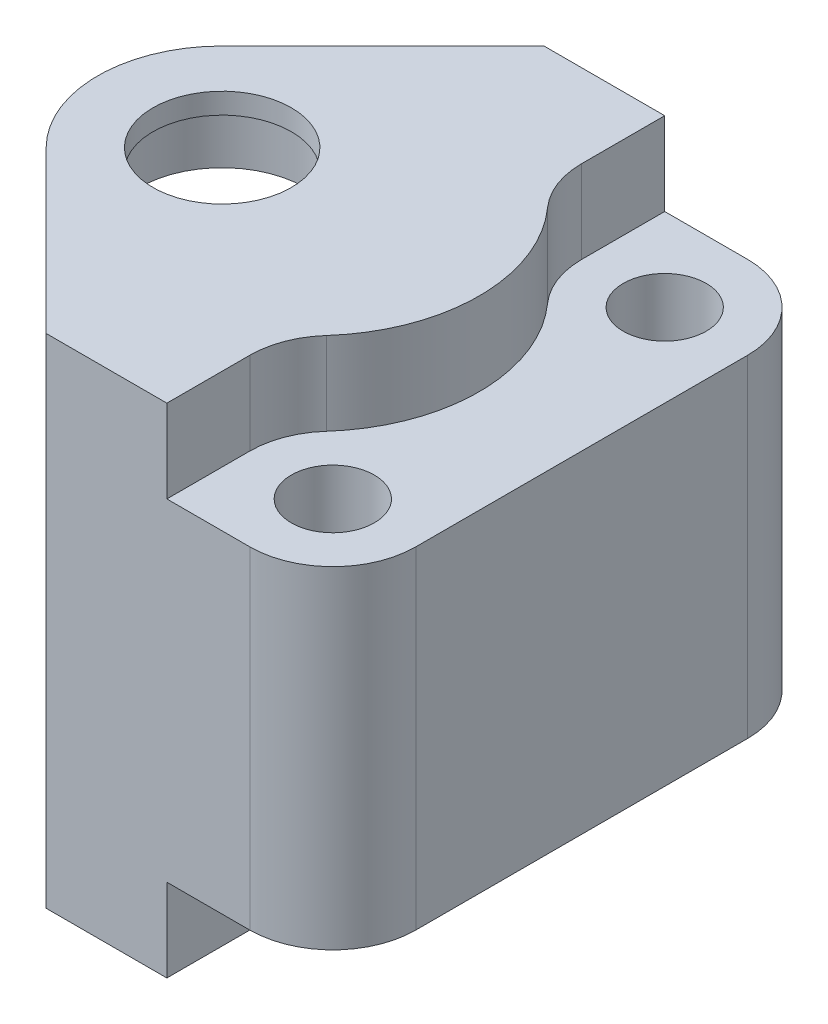
ISO-10303-21;
HEADER;
FILE_DESCRIPTION(('STEP AP214'),'2;1');
FILE_NAME('part.step','',(''),(''),'','','');
FILE_SCHEMA(('AUTOMOTIVE_DESIGN { 1 0 10303 214 1 1 1 1 }'));
ENDSEC;
DATA;
#1=APPLICATION_CONTEXT('core data for automotive mechanical design processes');
#2=APPLICATION_PROTOCOL_DEFINITION('international standard','automotive_design',2000,#1);
#3=PRODUCT_CONTEXT('',#1,'mechanical');
#4=PRODUCT('Part','Part','',(#3));
#5=PRODUCT_RELATED_PRODUCT_CATEGORY('part','',(#4));
#6=PRODUCT_DEFINITION_FORMATION('','',#4);
#7=PRODUCT_DEFINITION_CONTEXT('part definition',#1,'design');
#8=PRODUCT_DEFINITION('design','',#6,#7);
#9=PRODUCT_DEFINITION_SHAPE('','',#8);
#10=(LENGTH_UNIT() NAMED_UNIT(*) SI_UNIT(.MILLI.,.METRE.));
#11=(NAMED_UNIT(*) PLANE_ANGLE_UNIT() SI_UNIT($,.RADIAN.));
#12=(NAMED_UNIT(*) SI_UNIT($,.STERADIAN.) SOLID_ANGLE_UNIT());
#13=UNCERTAINTY_MEASURE_WITH_UNIT(LENGTH_MEASURE(1.E-05),#10,'distance_accuracy_value','');
#14=(GEOMETRIC_REPRESENTATION_CONTEXT(3) GLOBAL_UNCERTAINTY_ASSIGNED_CONTEXT((#13)) GLOBAL_UNIT_ASSIGNED_CONTEXT((#10,
#11,#12)) REPRESENTATION_CONTEXT('',''));
#15=CARTESIAN_POINT('',(0.,0.,0.));
#16=DIRECTION('',(0.,0.,1.));
#17=DIRECTION('',(1.,0.,0.));
#18=AXIS2_PLACEMENT_3D('',#15,#16,#17);
#19=CARTESIAN_POINT('',(13.,9.,-6.));
#20=DIRECTION('',(-1.,0.,0.));
#21=DIRECTION('',(0.,0.,1.));
#22=AXIS2_PLACEMENT_3D('',#19,#20,#21);
#23=PLANE('',#22);
#24=DIRECTION('',(0.,0.,1.));
#25=VECTOR('',#24,1.);
#26=CARTESIAN_POINT('',(13.,-6.,0.));
#27=LINE('',#26,#25);
#28=CARTESIAN_POINT('',(13.,-6.,-6.));
#29=VERTEX_POINT('',#28);
#30=CARTESIAN_POINT('',(13.,-6.,6.));
#31=VERTEX_POINT('',#30);
#32=EDGE_CURVE('E260',#29,#31,#27,.T.);
#33=ORIENTED_EDGE('',*,*,#32,.F.);
#34=DIRECTION('',(0.,-1.,0.));
#35=VECTOR('',#34,1.);
#36=CARTESIAN_POINT('',(13.,9.,-6.));
#37=LINE('',#36,#35);
#38=CARTESIAN_POINT('',(13.,6.,-6.));
#39=VERTEX_POINT('',#38);
#40=EDGE_CURVE('E522',#39,#29,#37,.T.);
#41=ORIENTED_EDGE('',*,*,#40,.F.);
#42=DIRECTION('',(0.,0.,-1.));
#43=VECTOR('',#42,1.);
#44=CARTESIAN_POINT('',(13.,6.,0.));
#45=LINE('',#44,#43);
#46=CARTESIAN_POINT('',(13.,6.,6.));
#47=VERTEX_POINT('',#46);
#48=EDGE_CURVE('E328',#47,#39,#45,.T.);
#49=ORIENTED_EDGE('',*,*,#48,.F.);
#50=DIRECTION('',(0.,-1.,0.));
#51=VECTOR('',#50,1.);
#52=CARTESIAN_POINT('',(13.,9.,6.));
#53=LINE('',#52,#51);
#54=EDGE_CURVE('E523',#47,#31,#53,.T.);
#55=ORIENTED_EDGE('',*,*,#54,.T.);
#56=EDGE_LOOP('',(#33,#41,#49,#55));
#57=FACE_BOUND('',#56,.T.);
#58=ADVANCED_FACE('F44',(#57),#23,.F.);
#59=CARTESIAN_POINT('',(2.63603896932105,9.,9.));
#60=DIRECTION('',(0.,0.,-1.));
#61=DIRECTION('',(-1.,0.,0.));
#62=AXIS2_PLACEMENT_3D('',#59,#60,#61);
#63=PLANE('',#62);
#64=DIRECTION('',(-1.,0.,0.));
#65=VECTOR('',#64,1.);
#66=CARTESIAN_POINT('',(0.,-6.,9.));
#67=LINE('',#66,#65);
#68=CARTESIAN_POINT('',(10.,-6.,9.));
#69=VERTEX_POINT('',#68);
#70=CARTESIAN_POINT('',(7.,-6.,9.));
#71=VERTEX_POINT('',#70);
#72=EDGE_CURVE('E246',#69,#71,#67,.T.);
#73=ORIENTED_EDGE('',*,*,#72,.F.);
#74=DIRECTION('',(0.,-1.,0.));
#75=VECTOR('',#74,1.);
#76=CARTESIAN_POINT('',(10.,9.,9.));
#77=LINE('',#76,#75);
#78=CARTESIAN_POINT('',(10.,6.,9.));
#79=VERTEX_POINT('',#78);
#80=EDGE_CURVE('E530',#79,#69,#77,.T.);
#81=ORIENTED_EDGE('',*,*,#80,.F.);
#82=DIRECTION('',(1.,0.,0.));
#83=VECTOR('',#82,1.);
#84=CARTESIAN_POINT('',(0.,6.,9.));
#85=LINE('',#84,#83);
#86=CARTESIAN_POINT('',(7.,6.,9.));
#87=VERTEX_POINT('',#86);
#88=EDGE_CURVE('E337',#87,#79,#85,.T.);
#89=ORIENTED_EDGE('',*,*,#88,.F.);
#90=DIRECTION('',(0.,1.,0.));
#91=VECTOR('',#90,1.);
#92=CARTESIAN_POINT('',(7.,6.,9.));
#93=LINE('',#92,#91);
#94=CARTESIAN_POINT('',(7.,9.,9.));
#95=VERTEX_POINT('',#94);
#96=EDGE_CURVE('E363',#87,#95,#93,.T.);
#97=ORIENTED_EDGE('',*,*,#96,.T.);
#98=DIRECTION('',(1.,0.,0.));
#99=VECTOR('',#98,1.);
#100=CARTESIAN_POINT('',(2.63603896932105,9.,9.));
#101=LINE('',#100,#99);
#102=CARTESIAN_POINT('',(2.63603896932105,9.,9.));
#103=VERTEX_POINT('',#102);
#104=EDGE_CURVE('E477',#103,#95,#101,.T.);
#105=ORIENTED_EDGE('',*,*,#104,.F.);
#106=DIRECTION('',(0.,-1.,0.));
#107=VECTOR('',#106,1.);
#108=CARTESIAN_POINT('',(2.63603896932105,9.,9.));
#109=LINE('',#108,#107);
#110=CARTESIAN_POINT('',(2.63603896932105,6.25,9.));
#111=VERTEX_POINT('',#110);
#112=EDGE_CURVE('E534',#103,#111,#109,.T.);
#113=ORIENTED_EDGE('',*,*,#112,.T.);
#114=DIRECTION('',(0.,-1.,0.));
#115=VECTOR('',#114,1.);
#116=CARTESIAN_POINT('',(2.63603896932105,6.25,9.));
#117=LINE('',#116,#115);
#118=CARTESIAN_POINT('',(2.63603896932105,-6.25,9.));
#119=VERTEX_POINT('',#118);
#120=EDGE_CURVE('E459',#111,#119,#117,.T.);
#121=ORIENTED_EDGE('',*,*,#120,.T.);
#122=CARTESIAN_POINT('',(2.63603896932105,-9.,9.));
#123=VERTEX_POINT('',#122);
#124=EDGE_CURVE('E531',#119,#123,#109,.T.);
#125=ORIENTED_EDGE('',*,*,#124,.T.);
#126=DIRECTION('',(1.,0.,0.));
#127=VECTOR('',#126,1.);
#128=CARTESIAN_POINT('',(2.63603896932105,-9.,9.));
#129=LINE('',#128,#127);
#130=CARTESIAN_POINT('',(7.,-9.,9.));
#131=VERTEX_POINT('',#130);
#132=EDGE_CURVE('E499',#123,#131,#129,.T.);
#133=ORIENTED_EDGE('',*,*,#132,.T.);
#134=DIRECTION('',(0.,-1.,0.));
#135=VECTOR('',#134,1.);
#136=CARTESIAN_POINT('',(7.,-6.,9.));
#137=LINE('',#136,#135);
#138=EDGE_CURVE('E297',#71,#131,#137,.T.);
#139=ORIENTED_EDGE('',*,*,#138,.F.);
#140=EDGE_LOOP('',(#73,#81,#89,#97,#105,#113,#121,#125,#133,#139));
#141=FACE_BOUND('',#140,.T.);
#142=ADVANCED_FACE('F567',(#141),#63,.F.);
#143=CARTESIAN_POINT('',(10.,9.,6.));
#144=DIRECTION('',(0.,-1.,0.));
#145=DIRECTION('',(0.,0.,-1.));
#146=AXIS2_PLACEMENT_3D('',#143,#144,#145);
#147=CYLINDRICAL_SURFACE('',#146,3.);
#148=CARTESIAN_POINT('',(10.,-6.,6.));
#149=DIRECTION('',(0.,-1.,0.));
#150=DIRECTION('',(0.,0.,-1.));
#151=AXIS2_PLACEMENT_3D('',#148,#149,#150);
#152=CIRCLE('',#151,3.);
#153=EDGE_CURVE('E255',#31,#69,#152,.T.);
#154=ORIENTED_EDGE('',*,*,#153,.F.);
#155=ORIENTED_EDGE('',*,*,#54,.F.);
#156=CARTESIAN_POINT('',(10.,6.,6.));
#157=DIRECTION('',(0.,-1.,0.));
#158=DIRECTION('',(0.,0.,-1.));
#159=AXIS2_PLACEMENT_3D('',#156,#157,#158);
#160=CIRCLE('',#159,3.);
#161=EDGE_CURVE('E335',#47,#79,#160,.T.);
#162=ORIENTED_EDGE('',*,*,#161,.T.);
#163=ORIENTED_EDGE('',*,*,#80,.T.);
#164=EDGE_LOOP('',(#154,#155,#162,#163));
#165=FACE_BOUND('',#164,.T.);
#166=ADVANCED_FACE('F573',(#165),#147,.T.);
#167=CARTESIAN_POINT('',(10.,9.,-6.));
#168=DIRECTION('',(0.,-1.,0.));
#169=DIRECTION('',(0.,0.,-1.));
#170=AXIS2_PLACEMENT_3D('',#167,#168,#169);
#171=CYLINDRICAL_SURFACE('',#170,3.);
#172=CARTESIAN_POINT('',(10.,-6.,-6.));
#173=DIRECTION('',(0.,-1.,0.));
#174=DIRECTION('',(0.,0.,-1.));
#175=AXIS2_PLACEMENT_3D('',#172,#173,#174);
#176=CIRCLE('',#175,3.);
#177=CARTESIAN_POINT('',(10.,-6.,-9.));
#178=VERTEX_POINT('',#177);
#179=EDGE_CURVE('E257',#178,#29,#176,.T.);
#180=ORIENTED_EDGE('',*,*,#179,.F.);
#181=DIRECTION('',(0.,-1.,0.));
#182=VECTOR('',#181,1.);
#183=CARTESIAN_POINT('',(10.,9.,-9.));
#184=LINE('',#183,#182);
#185=CARTESIAN_POINT('',(10.,6.,-9.));
#186=VERTEX_POINT('',#185);
#187=EDGE_CURVE('E520',#186,#178,#184,.T.);
#188=ORIENTED_EDGE('',*,*,#187,.F.);
#189=CARTESIAN_POINT('',(10.,6.,-6.));
#190=DIRECTION('',(0.,-1.,0.));
#191=DIRECTION('',(0.,0.,-1.));
#192=AXIS2_PLACEMENT_3D('',#189,#190,#191);
#193=CIRCLE('',#192,3.);
#194=EDGE_CURVE('E324',#186,#39,#193,.T.);
#195=ORIENTED_EDGE('',*,*,#194,.T.);
#196=ORIENTED_EDGE('',*,*,#40,.T.);
#197=EDGE_LOOP('',(#180,#188,#195,#196));
#198=FACE_BOUND('',#197,.T.);
#199=ADVANCED_FACE('F576',(#198),#171,.T.);
#200=CARTESIAN_POINT('',(10.,9.,-6.));
#201=DIRECTION('',(0.,-1.,0.));
#202=DIRECTION('',(0.,0.,-1.));
#203=AXIS2_PLACEMENT_3D('',#200,#201,#202);
#204=CYLINDRICAL_SURFACE('',#203,1.5);
#205=CARTESIAN_POINT('',(10.,6.,-6.));
#206=DIRECTION('',(0.,-1.,0.));
#207=DIRECTION('',(0.,0.,-1.));
#208=AXIS2_PLACEMENT_3D('',#205,#206,#207);
#209=CIRCLE('',#208,1.5);
#210=CARTESIAN_POINT('',(10.,6.,-7.5));
#211=VERTEX_POINT('',#210);
#212=EDGE_CURVE('E378',#211,#211,#209,.T.);
#213=ORIENTED_EDGE('',*,*,#212,.F.);
#214=EDGE_LOOP('',(#213));
#215=FACE_BOUND('',#214,.T.);
#216=CARTESIAN_POINT('',(10.,-6.,-6.));
#217=DIRECTION('',(0.,-1.,0.));
#218=DIRECTION('',(0.,0.,-1.));
#219=AXIS2_PLACEMENT_3D('',#216,#217,#218);
#220=CIRCLE('',#219,1.5);
#221=CARTESIAN_POINT('',(10.,-6.,-7.5));
#222=VERTEX_POINT('',#221);
#223=EDGE_CURVE('E302',#222,#222,#220,.T.);
#224=ORIENTED_EDGE('',*,*,#223,.T.);
#225=EDGE_LOOP('',(#224));
#226=FACE_BOUND('',#225,.T.);
#227=ADVANCED_FACE('F547',(#215,#226),#204,.F.);
#228=CARTESIAN_POINT('',(10.,9.,6.));
#229=DIRECTION('',(0.,-1.,0.));
#230=DIRECTION('',(0.,0.,-1.));
#231=AXIS2_PLACEMENT_3D('',#228,#229,#230);
#232=CYLINDRICAL_SURFACE('',#231,1.5);
#233=CARTESIAN_POINT('',(10.,6.,6.));
#234=DIRECTION('',(0.,-1.,0.));
#235=DIRECTION('',(0.,0.,-1.));
#236=AXIS2_PLACEMENT_3D('',#233,#234,#235);
#237=CIRCLE('',#236,1.5);
#238=CARTESIAN_POINT('',(10.,6.,4.5));
#239=VERTEX_POINT('',#238);
#240=EDGE_CURVE('E380',#239,#239,#237,.T.);
#241=ORIENTED_EDGE('',*,*,#240,.F.);
#242=EDGE_LOOP('',(#241));
#243=FACE_BOUND('',#242,.T.);
#244=CARTESIAN_POINT('',(10.,-6.,6.));
#245=DIRECTION('',(0.,-1.,0.));
#246=DIRECTION('',(0.,0.,-1.));
#247=AXIS2_PLACEMENT_3D('',#244,#245,#246);
#248=CIRCLE('',#247,1.5);
#249=CARTESIAN_POINT('',(10.,-6.,4.5));
#250=VERTEX_POINT('',#249);
#251=EDGE_CURVE('E47',#250,#250,#248,.T.);
#252=ORIENTED_EDGE('',*,*,#251,.T.);
#253=EDGE_LOOP('',(#252));
#254=FACE_BOUND('',#253,.T.);
#255=ADVANCED_FACE('F542',(#243,#254),#232,.F.);
#256=CARTESIAN_POINT('',(2.63603896932105,9.,-9.));
#257=DIRECTION('',(0.,0.,1.));
#258=DIRECTION('',(1.,0.,0.));
#259=AXIS2_PLACEMENT_3D('',#256,#257,#258);
#260=PLANE('',#259);
#261=DIRECTION('',(1.,0.,0.));
#262=VECTOR('',#261,1.);
#263=CARTESIAN_POINT('',(0.,-6.,-9.00000000000001));
#264=LINE('',#263,#262);
#265=CARTESIAN_POINT('',(7.,-6.,-9.));
#266=VERTEX_POINT('',#265);
#267=EDGE_CURVE('E263',#266,#178,#264,.T.);
#268=ORIENTED_EDGE('',*,*,#267,.F.);
#269=DIRECTION('',(0.,-1.,0.));
#270=VECTOR('',#269,1.);
#271=CARTESIAN_POINT('',(7.,-6.,-9.));
#272=LINE('',#271,#270);
#273=CARTESIAN_POINT('',(7.,-9.,-9.));
#274=VERTEX_POINT('',#273);
#275=EDGE_CURVE('E295',#266,#274,#272,.T.);
#276=ORIENTED_EDGE('',*,*,#275,.T.);
#277=DIRECTION('',(-1.,0.,0.));
#278=VECTOR('',#277,1.);
#279=CARTESIAN_POINT('',(2.63603896932105,-9.,-9.));
#280=LINE('',#279,#278);
#281=CARTESIAN_POINT('',(2.63603896932105,-9.,-9.));
#282=VERTEX_POINT('',#281);
#283=EDGE_CURVE('E505',#274,#282,#280,.T.);
#284=ORIENTED_EDGE('',*,*,#283,.T.);
#285=DIRECTION('',(0.,-1.,0.));
#286=VECTOR('',#285,1.);
#287=CARTESIAN_POINT('',(2.63603896932105,9.,-9.));
#288=LINE('',#287,#286);
#289=CARTESIAN_POINT('',(2.63603896932105,-6.25,-9.));
#290=VERTEX_POINT('',#289);
#291=EDGE_CURVE('E515',#290,#282,#288,.T.);
#292=ORIENTED_EDGE('',*,*,#291,.F.);
#293=DIRECTION('',(0.,-1.,0.));
#294=VECTOR('',#293,1.);
#295=CARTESIAN_POINT('',(2.63603896932105,6.25,-9.));
#296=LINE('',#295,#294);
#297=CARTESIAN_POINT('',(2.63603896932105,6.25,-9.));
#298=VERTEX_POINT('',#297);
#299=EDGE_CURVE('E463',#298,#290,#296,.T.);
#300=ORIENTED_EDGE('',*,*,#299,.F.);
#301=CARTESIAN_POINT('',(2.63603896932105,9.,-9.));
#302=VERTEX_POINT('',#301);
#303=EDGE_CURVE('E511',#302,#298,#288,.T.);
#304=ORIENTED_EDGE('',*,*,#303,.F.);
#305=DIRECTION('',(-1.,0.,0.));
#306=VECTOR('',#305,1.);
#307=CARTESIAN_POINT('',(2.63603896932105,9.,-9.));
#308=LINE('',#307,#306);
#309=CARTESIAN_POINT('',(7.,9.,-9.));
#310=VERTEX_POINT('',#309);
#311=EDGE_CURVE('E482',#310,#302,#308,.T.);
#312=ORIENTED_EDGE('',*,*,#311,.F.);
#313=DIRECTION('',(0.,1.,0.));
#314=VECTOR('',#313,1.);
#315=CARTESIAN_POINT('',(7.,6.,-9.));
#316=LINE('',#315,#314);
#317=CARTESIAN_POINT('',(7.,6.,-9.));
#318=VERTEX_POINT('',#317);
#319=EDGE_CURVE('E364',#318,#310,#316,.T.);
#320=ORIENTED_EDGE('',*,*,#319,.F.);
#321=DIRECTION('',(-1.,0.,0.));
#322=VECTOR('',#321,1.);
#323=CARTESIAN_POINT('',(0.,6.,-9.00000000000001));
#324=LINE('',#323,#322);
#325=EDGE_CURVE('E321',#186,#318,#324,.T.);
#326=ORIENTED_EDGE('',*,*,#325,.F.);
#327=ORIENTED_EDGE('',*,*,#187,.T.);
#328=EDGE_LOOP('',(#268,#276,#284,#292,#300,#304,#312,#320,#326,#327));
#329=FACE_BOUND('',#328,.T.);
#330=ADVANCED_FACE('F550',(#329),#260,.F.);
#331=CARTESIAN_POINT('',(-3.18198051533947,9.,3.18198051533946));
#332=DIRECTION('',(0.707106781186549,0.,-0.707106781186546));
#333=DIRECTION('',(-0.707106781186546,0.,-0.707106781186549));
#334=AXIS2_PLACEMENT_3D('',#331,#332,#333);
#335=PLANE('',#334);
#336=DIRECTION('',(0.707106781186546,0.,0.707106781186549));
#337=VECTOR('',#336,1.);
#338=CARTESIAN_POINT('',(-3.18198051533947,-6.25,3.18198051533946));
#339=LINE('',#338,#337);
#340=CARTESIAN_POINT('',(-3.18198051533947,-6.25,3.18198051533946));
#341=VERTEX_POINT('',#340);
#342=EDGE_CURVE('E452',#341,#119,#339,.T.);
#343=ORIENTED_EDGE('',*,*,#342,.F.);
#344=DIRECTION('',(0.,-1.,0.));
#345=VECTOR('',#344,1.);
#346=CARTESIAN_POINT('',(-3.18198051533947,9.,3.18198051533946));
#347=LINE('',#346,#345);
#348=CARTESIAN_POINT('',(-3.18198051533947,-9.,3.18198051533946));
#349=VERTEX_POINT('',#348);
#350=EDGE_CURVE('E54',#341,#349,#347,.T.);
#351=ORIENTED_EDGE('',*,*,#350,.T.);
#352=DIRECTION('',(0.707106781186546,0.,0.707106781186549));
#353=VECTOR('',#352,1.);
#354=CARTESIAN_POINT('',(-3.18198051533947,-9.,3.18198051533946));
#355=LINE('',#354,#353);
#356=EDGE_CURVE('E493',#349,#123,#355,.T.);
#357=ORIENTED_EDGE('',*,*,#356,.T.);
#358=ORIENTED_EDGE('',*,*,#124,.F.);
#359=EDGE_LOOP('',(#343,#351,#357,#358));
#360=FACE_BOUND('',#359,.T.);
#361=ADVANCED_FACE('F590',(#360),#335,.F.);
#362=CARTESIAN_POINT('',(-3.18198051533947,9.,-3.18198051533946));
#363=DIRECTION('',(0.707106781186549,0.,0.707106781186546));
#364=DIRECTION('',(0.707106781186546,0.,-0.707106781186549));
#365=AXIS2_PLACEMENT_3D('',#362,#363,#364);
#366=PLANE('',#365);
#367=DIRECTION('',(-0.707106781186546,0.,0.707106781186549));
#368=VECTOR('',#367,1.);
#369=CARTESIAN_POINT('',(2.63603896932105,-6.25,-9.));
#370=LINE('',#369,#368);
#371=CARTESIAN_POINT('',(-3.18198051533947,-6.25,-3.18198051533946));
#372=VERTEX_POINT('',#371);
#373=EDGE_CURVE('E443',#290,#372,#370,.T.);
#374=ORIENTED_EDGE('',*,*,#373,.F.);
#375=ORIENTED_EDGE('',*,*,#291,.T.);
#376=DIRECTION('',(-0.707106781186546,0.,0.707106781186549));
#377=VECTOR('',#376,1.);
#378=CARTESIAN_POINT('',(-3.18198051533947,-9.,-3.18198051533946));
#379=LINE('',#378,#377);
#380=CARTESIAN_POINT('',(-3.18198051533947,-9.,-3.18198051533946));
#381=VERTEX_POINT('',#380);
#382=EDGE_CURVE('E480',#282,#381,#379,.T.);
#383=ORIENTED_EDGE('',*,*,#382,.T.);
#384=DIRECTION('',(0.,-1.,0.));
#385=VECTOR('',#384,1.);
#386=CARTESIAN_POINT('',(-3.18198051533947,9.,-3.18198051533946));
#387=LINE('',#386,#385);
#388=EDGE_CURVE('E489',#372,#381,#387,.T.);
#389=ORIENTED_EDGE('',*,*,#388,.F.);
#390=EDGE_LOOP('',(#374,#375,#383,#389));
#391=FACE_BOUND('',#390,.T.);
#392=ADVANCED_FACE('F594',(#391),#366,.F.);
#393=CARTESIAN_POINT('',(0.,9.,0.));
#394=DIRECTION('',(0.,-1.,0.));
#395=DIRECTION('',(0.,0.,-1.));
#396=AXIS2_PLACEMENT_3D('',#393,#394,#395);
#397=CYLINDRICAL_SURFACE('',#396,4.5);
#398=CARTESIAN_POINT('',(0.,-6.25,0.));
#399=DIRECTION('',(0.,1.,0.));
#400=DIRECTION('',(0.,0.,1.));
#401=AXIS2_PLACEMENT_3D('',#398,#399,#400);
#402=CIRCLE('',#401,4.5);
#403=EDGE_CURVE('E448',#372,#341,#402,.T.);
#404=ORIENTED_EDGE('',*,*,#403,.F.);
#405=ORIENTED_EDGE('',*,*,#388,.T.);
#406=CARTESIAN_POINT('',(0.,-9.,0.));
#407=DIRECTION('',(0.,1.,0.));
#408=DIRECTION('',(0.,0.,-1.));
#409=AXIS2_PLACEMENT_3D('',#406,#407,#408);
#410=CIRCLE('',#409,4.5);
#411=EDGE_CURVE('E473',#381,#349,#410,.T.);
#412=ORIENTED_EDGE('',*,*,#411,.T.);
#413=ORIENTED_EDGE('',*,*,#350,.F.);
#414=EDGE_LOOP('',(#404,#405,#412,#413));
#415=FACE_BOUND('',#414,.T.);
#416=ADVANCED_FACE('F598',(#415),#397,.T.);
#417=CARTESIAN_POINT('',(0.,9.,0.));
#418=DIRECTION('',(0.,-1.,0.));
#419=DIRECTION('',(0.,0.,-1.));
#420=AXIS2_PLACEMENT_3D('',#417,#418,#419);
#421=PLANE('',#420);
#422=DIRECTION('',(0.,0.,1.));
#423=VECTOR('',#422,1.);
#424=CARTESIAN_POINT('',(7.,9.,0.));
#425=LINE('',#424,#423);
#426=CARTESIAN_POINT('',(7.,9.,-6.));
#427=VERTEX_POINT('',#426);
#428=EDGE_CURVE('E72',#310,#427,#425,.T.);
#429=ORIENTED_EDGE('',*,*,#428,.F.);
#430=ORIENTED_EDGE('',*,*,#311,.T.);
#431=DIRECTION('',(-0.707106781186546,0.,0.707106781186549));
#432=VECTOR('',#431,1.);
#433=CARTESIAN_POINT('',(-3.18198051533947,9.,-3.18198051533946));
#434=LINE('',#433,#432);
#435=CARTESIAN_POINT('',(-3.18198051533947,9.,-3.18198051533946));
#436=VERTEX_POINT('',#435);
#437=EDGE_CURVE('E490',#302,#436,#434,.T.);
#438=ORIENTED_EDGE('',*,*,#437,.T.);
#439=CARTESIAN_POINT('',(0.,9.,0.));
#440=DIRECTION('',(0.,1.,0.));
#441=DIRECTION('',(0.,0.,-1.));
#442=AXIS2_PLACEMENT_3D('',#439,#440,#441);
#443=CIRCLE('',#442,4.5);
#444=CARTESIAN_POINT('',(-3.18198051533947,9.,3.18198051533946));
#445=VERTEX_POINT('',#444);
#446=EDGE_CURVE('E472',#436,#445,#443,.T.);
#447=ORIENTED_EDGE('',*,*,#446,.T.);
#448=DIRECTION('',(0.707106781186546,0.,0.707106781186549));
#449=VECTOR('',#448,1.);
#450=CARTESIAN_POINT('',(-3.18198051533947,9.,3.18198051533946));
#451=LINE('',#450,#449);
#452=EDGE_CURVE('E478',#445,#103,#451,.T.);
#453=ORIENTED_EDGE('',*,*,#452,.T.);
#454=ORIENTED_EDGE('',*,*,#104,.T.);
#455=DIRECTION('',(0.,0.,1.));
#456=VECTOR('',#455,1.);
#457=CARTESIAN_POINT('',(7.,9.,0.));
#458=LINE('',#457,#456);
#459=CARTESIAN_POINT('',(7.,9.,6.));
#460=VERTEX_POINT('',#459);
#461=EDGE_CURVE('E309',#460,#95,#458,.T.);
#462=ORIENTED_EDGE('',*,*,#461,.F.);
#463=CARTESIAN_POINT('',(10.,9.,6.));
#464=DIRECTION('',(0.,-1.,0.));
#465=DIRECTION('',(0.,0.,-1.));
#466=AXIS2_PLACEMENT_3D('',#463,#464,#465);
#467=CIRCLE('',#466,3.);
#468=CARTESIAN_POINT('',(7.76393202250021,9.,4.));
#469=VERTEX_POINT('',#468);
#470=EDGE_CURVE('E303',#460,#469,#467,.T.);
#471=ORIENTED_EDGE('',*,*,#470,.T.);
#472=CARTESIAN_POINT('',(3.29179606750063,9.,0.));
#473=DIRECTION('',(0.,-1.,0.));
#474=DIRECTION('',(0.,0.,-1.));
#475=AXIS2_PLACEMENT_3D('',#472,#473,#474);
#476=CIRCLE('',#475,6.);
#477=CARTESIAN_POINT('',(7.76393202250021,9.,-4.));
#478=VERTEX_POINT('',#477);
#479=EDGE_CURVE('E350',#478,#469,#476,.T.);
#480=ORIENTED_EDGE('',*,*,#479,.F.);
#481=CARTESIAN_POINT('',(10.,9.,-6.));
#482=DIRECTION('',(0.,-1.,0.));
#483=DIRECTION('',(0.,0.,-1.));
#484=AXIS2_PLACEMENT_3D('',#481,#482,#483);
#485=CIRCLE('',#484,3.);
#486=EDGE_CURVE('E352',#478,#427,#485,.T.);
#487=ORIENTED_EDGE('',*,*,#486,.T.);
#488=EDGE_LOOP('',(#429,#430,#438,#447,#453,#454,#462,#471,#480,#487));
#489=FACE_BOUND('',#488,.T.);
#490=CARTESIAN_POINT('',(0.,9.,0.));
#491=DIRECTION('',(0.,-1.,0.));
#492=DIRECTION('',(0.,0.,-1.));
#493=AXIS2_PLACEMENT_3D('',#490,#491,#492);
#494=CIRCLE('',#493,2.5);
#495=CARTESIAN_POINT('',(0.,9.,-2.5));
#496=VERTEX_POINT('',#495);
#497=EDGE_CURVE('E397',#496,#496,#494,.T.);
#498=ORIENTED_EDGE('',*,*,#497,.T.);
#499=EDGE_LOOP('',(#498));
#500=FACE_BOUND('',#499,.T.);
#501=ADVANCED_FACE('F669',(#489,#500),#421,.F.);
#502=CARTESIAN_POINT('',(0.,-9.,0.));
#503=DIRECTION('',(0.,-1.,0.));
#504=DIRECTION('',(0.,0.,-1.));
#505=AXIS2_PLACEMENT_3D('',#502,#503,#504);
#506=PLANE('',#505);
#507=DIRECTION('',(0.,0.,-1.));
#508=VECTOR('',#507,1.);
#509=CARTESIAN_POINT('',(7.,-9.,0.));
#510=LINE('',#509,#508);
#511=CARTESIAN_POINT('',(7.,-9.,-6.));
#512=VERTEX_POINT('',#511);
#513=EDGE_CURVE('E282',#512,#274,#510,.T.);
#514=ORIENTED_EDGE('',*,*,#513,.F.);
#515=CARTESIAN_POINT('',(10.,-9.,-6.));
#516=DIRECTION('',(0.,-1.,0.));
#517=DIRECTION('',(0.,0.,-1.));
#518=AXIS2_PLACEMENT_3D('',#515,#516,#517);
#519=CIRCLE('',#518,3.);
#520=CARTESIAN_POINT('',(7.76393202250021,-9.,-4.));
#521=VERTEX_POINT('',#520);
#522=EDGE_CURVE('E235',#521,#512,#519,.T.);
#523=ORIENTED_EDGE('',*,*,#522,.F.);
#524=CARTESIAN_POINT('',(3.29179606750063,-9.,0.));
#525=DIRECTION('',(0.,-1.,0.));
#526=DIRECTION('',(0.,0.,-1.));
#527=AXIS2_PLACEMENT_3D('',#524,#525,#526);
#528=CIRCLE('',#527,6.);
#529=CARTESIAN_POINT('',(7.76393202250021,-9.,4.));
#530=VERTEX_POINT('',#529);
#531=EDGE_CURVE('E63',#521,#530,#528,.T.);
#532=ORIENTED_EDGE('',*,*,#531,.T.);
#533=CARTESIAN_POINT('',(10.,-9.,6.));
#534=DIRECTION('',(0.,-1.,0.));
#535=DIRECTION('',(0.,0.,-1.));
#536=AXIS2_PLACEMENT_3D('',#533,#534,#535);
#537=CIRCLE('',#536,3.);
#538=CARTESIAN_POINT('',(7.,-9.,6.));
#539=VERTEX_POINT('',#538);
#540=EDGE_CURVE('E239',#539,#530,#537,.T.);
#541=ORIENTED_EDGE('',*,*,#540,.F.);
#542=DIRECTION('',(0.,0.,-1.));
#543=VECTOR('',#542,1.);
#544=CARTESIAN_POINT('',(7.,-9.,0.));
#545=LINE('',#544,#543);
#546=EDGE_CURVE('E280',#131,#539,#545,.T.);
#547=ORIENTED_EDGE('',*,*,#546,.F.);
#548=ORIENTED_EDGE('',*,*,#132,.F.);
#549=ORIENTED_EDGE('',*,*,#356,.F.);
#550=ORIENTED_EDGE('',*,*,#411,.F.);
#551=ORIENTED_EDGE('',*,*,#382,.F.);
#552=ORIENTED_EDGE('',*,*,#283,.F.);
#553=EDGE_LOOP('',(#514,#523,#532,#541,#547,#548,#549,#550,#551,#552));
#554=FACE_BOUND('',#553,.T.);
#555=CARTESIAN_POINT('',(0.,-9.,0.));
#556=DIRECTION('',(0.,-1.,0.));
#557=DIRECTION('',(0.,0.,-1.));
#558=AXIS2_PLACEMENT_3D('',#555,#556,#557);
#559=CIRCLE('',#558,2.5);
#560=CARTESIAN_POINT('',(0.,-9.,-2.5));
#561=VERTEX_POINT('',#560);
#562=EDGE_CURVE('E389',#561,#561,#559,.T.);
#563=ORIENTED_EDGE('',*,*,#562,.F.);
#564=EDGE_LOOP('',(#563));
#565=FACE_BOUND('',#564,.T.);
#566=ADVANCED_FACE('F596',(#554,#565),#506,.T.);
#567=CARTESIAN_POINT('',(-3.18198051533947,6.25,-3.18198051533946));
#568=VERTEX_POINT('',#567);
#569=EDGE_CURVE('E509',#436,#568,#387,.T.);
#570=ORIENTED_EDGE('',*,*,#569,.T.);
#571=CARTESIAN_POINT('',(0.,6.25,0.));
#572=DIRECTION('',(0.,1.,0.));
#573=DIRECTION('',(0.,0.,1.));
#574=AXIS2_PLACEMENT_3D('',#571,#572,#573);
#575=CIRCLE('',#574,4.5);
#576=CARTESIAN_POINT('',(-3.18198051533947,6.25,3.18198051533946));
#577=VERTEX_POINT('',#576);
#578=EDGE_CURVE('E430',#568,#577,#575,.T.);
#579=ORIENTED_EDGE('',*,*,#578,.T.);
#580=EDGE_CURVE('E11',#445,#577,#347,.T.);
#581=ORIENTED_EDGE('',*,*,#580,.F.);
#582=ORIENTED_EDGE('',*,*,#446,.F.);
#583=EDGE_LOOP('',(#570,#579,#581,#582));
#584=FACE_BOUND('',#583,.T.);
#585=ADVANCED_FACE('F50',(#584),#397,.T.);
#586=ORIENTED_EDGE('',*,*,#580,.T.);
#587=DIRECTION('',(0.707106781186546,0.,0.707106781186549));
#588=VECTOR('',#587,1.);
#589=CARTESIAN_POINT('',(-3.18198051533947,6.25,3.18198051533946));
#590=LINE('',#589,#588);
#591=EDGE_CURVE('E431',#577,#111,#590,.T.);
#592=ORIENTED_EDGE('',*,*,#591,.T.);
#593=ORIENTED_EDGE('',*,*,#112,.F.);
#594=ORIENTED_EDGE('',*,*,#452,.F.);
#595=EDGE_LOOP('',(#586,#592,#593,#594));
#596=FACE_BOUND('',#595,.T.);
#597=ADVANCED_FACE('F581',(#596),#335,.F.);
#598=ORIENTED_EDGE('',*,*,#303,.T.);
#599=DIRECTION('',(-0.707106781186546,0.,0.707106781186549));
#600=VECTOR('',#599,1.);
#601=CARTESIAN_POINT('',(2.63603896932105,6.25,-9.));
#602=LINE('',#601,#600);
#603=EDGE_CURVE('E421',#298,#568,#602,.T.);
#604=ORIENTED_EDGE('',*,*,#603,.T.);
#605=ORIENTED_EDGE('',*,*,#569,.F.);
#606=ORIENTED_EDGE('',*,*,#437,.F.);
#607=EDGE_LOOP('',(#598,#604,#605,#606));
#608=FACE_BOUND('',#607,.T.);
#609=ADVANCED_FACE('F584',(#608),#366,.F.);
#610=CARTESIAN_POINT('',(0.,6.25,0.));
#611=DIRECTION('',(0.,-1.,0.));
#612=DIRECTION('',(0.,0.,-1.));
#613=AXIS2_PLACEMENT_3D('',#610,#611,#612);
#614=CYLINDRICAL_SURFACE('',#613,5.25);
#615=CARTESIAN_POINT('',(0.,-6.25,0.));
#616=DIRECTION('',(0.,1.,0.));
#617=DIRECTION('',(0.,0.,-1.));
#618=AXIS2_PLACEMENT_3D('',#615,#616,#617);
#619=CIRCLE('',#618,5.25);
#620=CARTESIAN_POINT('',(5.00096940847824,-6.25,1.59774997276322));
#621=VERTEX_POINT('',#620);
#622=CARTESIAN_POINT('',(5.00096940847824,-6.25,-1.59774997276322));
#623=VERTEX_POINT('',#622);
#624=EDGE_CURVE('E398',#621,#623,#619,.T.);
#625=ORIENTED_EDGE('',*,*,#624,.F.);
#626=DIRECTION('',(0.,-1.,0.));
#627=VECTOR('',#626,1.);
#628=CARTESIAN_POINT('',(5.00096940847824,6.25,1.59774997276322));
#629=LINE('',#628,#627);
#630=CARTESIAN_POINT('',(5.00096940847824,6.25,1.59774997276322));
#631=VERTEX_POINT('',#630);
#632=EDGE_CURVE('E437',#631,#621,#629,.T.);
#633=ORIENTED_EDGE('',*,*,#632,.F.);
#634=CARTESIAN_POINT('',(0.,6.25,0.));
#635=DIRECTION('',(0.,1.,0.));
#636=DIRECTION('',(0.,0.,-1.));
#637=AXIS2_PLACEMENT_3D('',#634,#635,#636);
#638=CIRCLE('',#637,5.25);
#639=CARTESIAN_POINT('',(5.00096940847824,6.25,-1.59774997276322));
#640=VERTEX_POINT('',#639);
#641=EDGE_CURVE('E413',#631,#640,#638,.T.);
#642=ORIENTED_EDGE('',*,*,#641,.T.);
#643=DIRECTION('',(0.,-1.,0.));
#644=VECTOR('',#643,1.);
#645=CARTESIAN_POINT('',(5.00096940847824,6.25,-1.59774997276322));
#646=LINE('',#645,#644);
#647=EDGE_CURVE('E470',#640,#623,#646,.T.);
#648=ORIENTED_EDGE('',*,*,#647,.T.);
#649=EDGE_LOOP('',(#625,#633,#642,#648));
#650=FACE_BOUND('',#649,.T.);
#651=ADVANCED_FACE('F595',(#650),#614,.F.);
#652=CARTESIAN_POINT('',(5.00096940847824,6.25,-1.59774997276322));
#653=DIRECTION('',(-0.952565601614902,0.,0.304333328145375));
#654=DIRECTION('',(0.304333328145375,0.,0.952565601614902));
#655=AXIS2_PLACEMENT_3D('',#652,#653,#654);
#656=PLANE('',#655);
#657=DIRECTION('',(-0.304333328145375,0.,-0.952565601614902));
#658=VECTOR('',#657,1.);
#659=CARTESIAN_POINT('',(5.00096940847824,-6.25,-1.59774997276322));
#660=LINE('',#659,#658);
#661=EDGE_CURVE('E445',#623,#290,#660,.T.);
#662=ORIENTED_EDGE('',*,*,#661,.F.);
#663=ORIENTED_EDGE('',*,*,#647,.F.);
#664=DIRECTION('',(-0.304333328145375,0.,-0.952565601614902));
#665=VECTOR('',#664,1.);
#666=CARTESIAN_POINT('',(5.00096940847824,6.25,-1.59774997276322));
#667=LINE('',#666,#665);
#668=EDGE_CURVE('E420',#640,#298,#667,.T.);
#669=ORIENTED_EDGE('',*,*,#668,.T.);
#670=ORIENTED_EDGE('',*,*,#299,.T.);
#671=EDGE_LOOP('',(#662,#663,#669,#670));
#672=FACE_BOUND('',#671,.T.);
#673=ADVANCED_FACE('F653',(#672),#656,.T.);
#674=CARTESIAN_POINT('',(2.63603896932105,6.25,9.));
#675=DIRECTION('',(-0.952565601614902,0.,-0.304333328145375));
#676=DIRECTION('',(-0.304333328145375,0.,0.952565601614902));
#677=AXIS2_PLACEMENT_3D('',#674,#675,#676);
#678=PLANE('',#677);
#679=DIRECTION('',(0.304333328145375,0.,-0.952565601614902));
#680=VECTOR('',#679,1.);
#681=CARTESIAN_POINT('',(2.63603896932105,-6.25,9.));
#682=LINE('',#681,#680);
#683=EDGE_CURVE('E419',#119,#621,#682,.T.);
#684=ORIENTED_EDGE('',*,*,#683,.F.);
#685=ORIENTED_EDGE('',*,*,#120,.F.);
#686=DIRECTION('',(0.304333328145375,0.,-0.952565601614902));
#687=VECTOR('',#686,1.);
#688=CARTESIAN_POINT('',(2.63603896932105,6.25,9.));
#689=LINE('',#688,#687);
#690=EDGE_CURVE('E434',#111,#631,#689,.T.);
#691=ORIENTED_EDGE('',*,*,#690,.T.);
#692=ORIENTED_EDGE('',*,*,#632,.T.);
#693=EDGE_LOOP('',(#684,#685,#691,#692));
#694=FACE_BOUND('',#693,.T.);
#695=ADVANCED_FACE('F637',(#694),#678,.T.);
#696=CARTESIAN_POINT('',(0.,6.25,0.));
#697=DIRECTION('',(0.,-1.,0.));
#698=DIRECTION('',(0.,0.,-1.));
#699=AXIS2_PLACEMENT_3D('',#696,#697,#698);
#700=PLANE('',#699);
#701=CARTESIAN_POINT('',(0.,6.25,0.));
#702=DIRECTION('',(0.,-1.,0.));
#703=DIRECTION('',(0.,0.,-1.));
#704=AXIS2_PLACEMENT_3D('',#701,#702,#703);
#705=CIRCLE('',#704,3.);
#706=CARTESIAN_POINT('',(0.,6.25,-3.));
#707=VERTEX_POINT('',#706);
#708=EDGE_CURVE('E382',#707,#707,#705,.T.);
#709=ORIENTED_EDGE('',*,*,#708,.F.);
#710=EDGE_LOOP('',(#709));
#711=FACE_BOUND('',#710,.T.);
#712=ORIENTED_EDGE('',*,*,#641,.F.);
#713=ORIENTED_EDGE('',*,*,#690,.F.);
#714=ORIENTED_EDGE('',*,*,#591,.F.);
#715=ORIENTED_EDGE('',*,*,#578,.F.);
#716=ORIENTED_EDGE('',*,*,#603,.F.);
#717=ORIENTED_EDGE('',*,*,#668,.F.);
#718=EDGE_LOOP('',(#712,#713,#714,#715,#716,#717));
#719=FACE_BOUND('',#718,.T.);
#720=ADVANCED_FACE('F643',(#711,#719),#700,.T.);
#721=CARTESIAN_POINT('',(0.,-6.25,0.));
#722=DIRECTION('',(0.,-1.,0.));
#723=DIRECTION('',(0.,0.,-1.));
#724=AXIS2_PLACEMENT_3D('',#721,#722,#723);
#725=PLANE('',#724);
#726=CARTESIAN_POINT('',(0.,-6.25,0.));
#727=DIRECTION('',(0.,-1.,0.));
#728=DIRECTION('',(0.,0.,-1.));
#729=AXIS2_PLACEMENT_3D('',#726,#727,#728);
#730=CIRCLE('',#729,3.);
#731=CARTESIAN_POINT('',(0.,-6.25,-3.));
#732=VERTEX_POINT('',#731);
#733=EDGE_CURVE('E385',#732,#732,#730,.T.);
#734=ORIENTED_EDGE('',*,*,#733,.T.);
#735=EDGE_LOOP('',(#734));
#736=FACE_BOUND('',#735,.T.);
#737=ORIENTED_EDGE('',*,*,#624,.T.);
#738=ORIENTED_EDGE('',*,*,#661,.T.);
#739=ORIENTED_EDGE('',*,*,#373,.T.);
#740=ORIENTED_EDGE('',*,*,#403,.T.);
#741=ORIENTED_EDGE('',*,*,#342,.T.);
#742=ORIENTED_EDGE('',*,*,#683,.T.);
#743=EDGE_LOOP('',(#737,#738,#739,#740,#741,#742));
#744=FACE_BOUND('',#743,.T.);
#745=ADVANCED_FACE('F654',(#736,#744),#725,.F.);
#746=CARTESIAN_POINT('',(0.,-11.5038439249527,0.));
#747=DIRECTION('',(0.,-1.,0.));
#748=DIRECTION('',(0.,0.,-1.));
#749=AXIS2_PLACEMENT_3D('',#746,#747,#748);
#750=CYLINDRICAL_SURFACE('',#749,2.5);
#751=ORIENTED_EDGE('',*,*,#562,.T.);
#752=EDGE_LOOP('',(#751));
#753=FACE_BOUND('',#752,.T.);
#754=CARTESIAN_POINT('',(0.,-8.25,0.));
#755=DIRECTION('',(0.,-1.,0.));
#756=DIRECTION('',(0.,0.,-1.));
#757=AXIS2_PLACEMENT_3D('',#754,#755,#756);
#758=CIRCLE('',#757,2.5);
#759=CARTESIAN_POINT('',(0.,-8.25,-2.5));
#760=VERTEX_POINT('',#759);
#761=EDGE_CURVE('E408',#760,#760,#758,.T.);
#762=ORIENTED_EDGE('',*,*,#761,.F.);
#763=EDGE_LOOP('',(#762));
#764=FACE_BOUND('',#763,.T.);
#765=ADVANCED_FACE('F863',(#753,#764),#750,.F.);
#766=CARTESIAN_POINT('',(-2.5,-8.25,0.));
#767=DIRECTION('',(0.,1.,0.));
#768=DIRECTION('',(0.,0.,1.));
#769=AXIS2_PLACEMENT_3D('',#766,#767,#768);
#770=PLANE('',#769);
#771=ORIENTED_EDGE('',*,*,#761,.T.);
#772=EDGE_LOOP('',(#771));
#773=FACE_BOUND('',#772,.T.);
#774=CARTESIAN_POINT('',(0.,-8.25,0.));
#775=DIRECTION('',(0.,-1.,0.));
#776=DIRECTION('',(0.,0.,-1.));
#777=AXIS2_PLACEMENT_3D('',#774,#775,#776);
#778=CIRCLE('',#777,3.);
#779=CARTESIAN_POINT('',(0.,-8.25,-3.));
#780=VERTEX_POINT('',#779);
#781=EDGE_CURVE('E404',#780,#780,#778,.T.);
#782=ORIENTED_EDGE('',*,*,#781,.F.);
#783=EDGE_LOOP('',(#782));
#784=FACE_BOUND('',#783,.T.);
#785=ADVANCED_FACE('F855',(#773,#784),#770,.T.);
#786=CARTESIAN_POINT('',(0.,-11.5038439249527,0.));
#787=DIRECTION('',(0.,-1.,0.));
#788=DIRECTION('',(0.,0.,-1.));
#789=AXIS2_PLACEMENT_3D('',#786,#787,#788);
#790=CYLINDRICAL_SURFACE('',#789,3.);
#791=ORIENTED_EDGE('',*,*,#781,.T.);
#792=EDGE_LOOP('',(#791));
#793=FACE_BOUND('',#792,.T.);
#794=ORIENTED_EDGE('',*,*,#733,.F.);
#795=EDGE_LOOP('',(#794));
#796=FACE_BOUND('',#795,.T.);
#797=ADVANCED_FACE('F841',(#793,#796),#790,.F.);
#798=CARTESIAN_POINT('',(0.,-11.5038439249527,0.));
#799=DIRECTION('',(0.,-1.,0.));
#800=DIRECTION('',(0.,0.,-1.));
#801=AXIS2_PLACEMENT_3D('',#798,#799,#800);
#802=CYLINDRICAL_SURFACE('',#801,2.5);
#803=CARTESIAN_POINT('',(0.,8.25,0.));
#804=DIRECTION('',(0.,-1.,0.));
#805=DIRECTION('',(0.,0.,-1.));
#806=AXIS2_PLACEMENT_3D('',#803,#804,#805);
#807=CIRCLE('',#806,2.5);
#808=CARTESIAN_POINT('',(0.,8.25,-2.5));
#809=VERTEX_POINT('',#808);
#810=EDGE_CURVE('E395',#809,#809,#807,.T.);
#811=ORIENTED_EDGE('',*,*,#810,.T.);
#812=EDGE_LOOP('',(#811));
#813=FACE_BOUND('',#812,.T.);
#814=ORIENTED_EDGE('',*,*,#497,.F.);
#815=EDGE_LOOP('',(#814));
#816=FACE_BOUND('',#815,.T.);
#817=ADVANCED_FACE('F834',(#813,#816),#802,.F.);
#818=CARTESIAN_POINT('',(-2.5,8.25,0.));
#819=DIRECTION('',(0.,-1.,0.));
#820=DIRECTION('',(0.,0.,-1.));
#821=AXIS2_PLACEMENT_3D('',#818,#819,#820);
#822=PLANE('',#821);
#823=CARTESIAN_POINT('',(0.,8.25,0.));
#824=DIRECTION('',(0.,-1.,0.));
#825=DIRECTION('',(0.,0.,-1.));
#826=AXIS2_PLACEMENT_3D('',#823,#824,#825);
#827=CIRCLE('',#826,3.);
#828=CARTESIAN_POINT('',(0.,8.25,-3.));
#829=VERTEX_POINT('',#828);
#830=EDGE_CURVE('E390',#829,#829,#827,.T.);
#831=ORIENTED_EDGE('',*,*,#830,.T.);
#832=EDGE_LOOP('',(#831));
#833=FACE_BOUND('',#832,.T.);
#834=ORIENTED_EDGE('',*,*,#810,.F.);
#835=EDGE_LOOP('',(#834));
#836=FACE_BOUND('',#835,.T.);
#837=ADVANCED_FACE('F824',(#833,#836),#822,.T.);
#838=CARTESIAN_POINT('',(0.,-11.5038439249527,0.));
#839=DIRECTION('',(0.,-1.,0.));
#840=DIRECTION('',(0.,0.,-1.));
#841=AXIS2_PLACEMENT_3D('',#838,#839,#840);
#842=CYLINDRICAL_SURFACE('',#841,3.);
#843=ORIENTED_EDGE('',*,*,#708,.T.);
#844=EDGE_LOOP('',(#843));
#845=FACE_BOUND('',#844,.T.);
#846=ORIENTED_EDGE('',*,*,#830,.F.);
#847=EDGE_LOOP('',(#846));
#848=FACE_BOUND('',#847,.T.);
#849=ADVANCED_FACE('F811',(#845,#848),#842,.F.);
#850=CARTESIAN_POINT('',(10.,6.,6.));
#851=DIRECTION('',(0.,1.,0.));
#852=DIRECTION('',(0.,0.,1.));
#853=AXIS2_PLACEMENT_3D('',#850,#851,#852);
#854=CYLINDRICAL_SURFACE('',#853,3.);
#855=ORIENTED_EDGE('',*,*,#470,.F.);
#856=DIRECTION('',(0.,1.,0.));
#857=VECTOR('',#856,1.);
#858=CARTESIAN_POINT('',(7.,6.,6.));
#859=LINE('',#858,#857);
#860=CARTESIAN_POINT('',(7.,6.,6.));
#861=VERTEX_POINT('',#860);
#862=EDGE_CURVE('E344',#861,#460,#859,.T.);
#863=ORIENTED_EDGE('',*,*,#862,.F.);
#864=CARTESIAN_POINT('',(10.,6.,6.));
#865=DIRECTION('',(0.,-1.,0.));
#866=DIRECTION('',(0.,0.,-1.));
#867=AXIS2_PLACEMENT_3D('',#864,#865,#866);
#868=CIRCLE('',#867,3.);
#869=CARTESIAN_POINT('',(7.76393202250021,6.,4.));
#870=VERTEX_POINT('',#869);
#871=EDGE_CURVE('E308',#861,#870,#868,.T.);
#872=ORIENTED_EDGE('',*,*,#871,.T.);
#873=DIRECTION('',(0.,1.,0.));
#874=VECTOR('',#873,1.);
#875=CARTESIAN_POINT('',(7.76393202250021,6.,4.));
#876=LINE('',#875,#874);
#877=EDGE_CURVE('E372',#870,#469,#876,.T.);
#878=ORIENTED_EDGE('',*,*,#877,.T.);
#879=EDGE_LOOP('',(#855,#863,#872,#878));
#880=FACE_BOUND('',#879,.T.);
#881=ADVANCED_FACE('F801',(#880),#854,.F.);
#882=CARTESIAN_POINT('',(3.29179606750063,6.,0.));
#883=DIRECTION('',(0.,1.,0.));
#884=DIRECTION('',(0.,0.,1.));
#885=AXIS2_PLACEMENT_3D('',#882,#883,#884);
#886=CYLINDRICAL_SURFACE('',#885,6.);
#887=ORIENTED_EDGE('',*,*,#479,.T.);
#888=ORIENTED_EDGE('',*,*,#877,.F.);
#889=CARTESIAN_POINT('',(3.29179606750063,6.,0.));
#890=DIRECTION('',(0.,-1.,0.));
#891=DIRECTION('',(0.,0.,-1.));
#892=AXIS2_PLACEMENT_3D('',#889,#890,#891);
#893=CIRCLE('',#892,6.);
#894=CARTESIAN_POINT('',(7.76393202250021,6.,-4.));
#895=VERTEX_POINT('',#894);
#896=EDGE_CURVE('E310',#895,#870,#893,.T.);
#897=ORIENTED_EDGE('',*,*,#896,.F.);
#898=DIRECTION('',(0.,1.,0.));
#899=VECTOR('',#898,1.);
#900=CARTESIAN_POINT('',(7.76393202250021,6.,-4.));
#901=LINE('',#900,#899);
#902=EDGE_CURVE('E371',#895,#478,#901,.T.);
#903=ORIENTED_EDGE('',*,*,#902,.T.);
#904=EDGE_LOOP('',(#887,#888,#897,#903));
#905=FACE_BOUND('',#904,.T.);
#906=ADVANCED_FACE('F794',(#905),#886,.T.);
#907=CARTESIAN_POINT('',(10.,6.,-6.));
#908=DIRECTION('',(0.,1.,0.));
#909=DIRECTION('',(0.,0.,1.));
#910=AXIS2_PLACEMENT_3D('',#907,#908,#909);
#911=CYLINDRICAL_SURFACE('',#910,3.);
#912=ORIENTED_EDGE('',*,*,#486,.F.);
#913=ORIENTED_EDGE('',*,*,#902,.F.);
#914=CARTESIAN_POINT('',(10.,6.,-6.));
#915=DIRECTION('',(0.,-1.,0.));
#916=DIRECTION('',(0.,0.,-1.));
#917=AXIS2_PLACEMENT_3D('',#914,#915,#916);
#918=CIRCLE('',#917,3.);
#919=CARTESIAN_POINT('',(7.,6.,-6.));
#920=VERTEX_POINT('',#919);
#921=EDGE_CURVE('E314',#895,#920,#918,.T.);
#922=ORIENTED_EDGE('',*,*,#921,.T.);
#923=DIRECTION('',(0.,1.,0.));
#924=VECTOR('',#923,1.);
#925=CARTESIAN_POINT('',(7.,6.,-6.));
#926=LINE('',#925,#924);
#927=EDGE_CURVE('E366',#920,#427,#926,.T.);
#928=ORIENTED_EDGE('',*,*,#927,.T.);
#929=EDGE_LOOP('',(#912,#913,#922,#928));
#930=FACE_BOUND('',#929,.T.);
#931=ADVANCED_FACE('F787',(#930),#911,.F.);
#932=CARTESIAN_POINT('',(7.,6.,0.));
#933=DIRECTION('',(-1.,0.,0.));
#934=DIRECTION('',(0.,0.,1.));
#935=AXIS2_PLACEMENT_3D('',#932,#933,#934);
#936=PLANE('',#935);
#937=ORIENTED_EDGE('',*,*,#428,.T.);
#938=ORIENTED_EDGE('',*,*,#927,.F.);
#939=DIRECTION('',(0.,0.,1.));
#940=VECTOR('',#939,1.);
#941=CARTESIAN_POINT('',(7.,6.,0.));
#942=LINE('',#941,#940);
#943=EDGE_CURVE('E320',#318,#920,#942,.T.);
#944=ORIENTED_EDGE('',*,*,#943,.F.);
#945=ORIENTED_EDGE('',*,*,#319,.T.);
#946=EDGE_LOOP('',(#937,#938,#944,#945));
#947=FACE_BOUND('',#946,.T.);
#948=ADVANCED_FACE('F780',(#947),#936,.F.);
#949=CARTESIAN_POINT('',(7.,6.,0.));
#950=DIRECTION('',(-1.,0.,0.));
#951=DIRECTION('',(0.,0.,1.));
#952=AXIS2_PLACEMENT_3D('',#949,#950,#951);
#953=PLANE('',#952);
#954=ORIENTED_EDGE('',*,*,#461,.T.);
#955=ORIENTED_EDGE('',*,*,#96,.F.);
#956=DIRECTION('',(0.,0.,1.));
#957=VECTOR('',#956,1.);
#958=CARTESIAN_POINT('',(7.,6.,0.));
#959=LINE('',#958,#957);
#960=EDGE_CURVE('E339',#861,#87,#959,.T.);
#961=ORIENTED_EDGE('',*,*,#960,.F.);
#962=ORIENTED_EDGE('',*,*,#862,.T.);
#963=EDGE_LOOP('',(#954,#955,#961,#962));
#964=FACE_BOUND('',#963,.T.);
#965=ADVANCED_FACE('F767',(#964),#953,.F.);
#966=CARTESIAN_POINT('',(10.,6.,6.));
#967=DIRECTION('',(0.,-1.,0.));
#968=DIRECTION('',(0.,0.,-1.));
#969=AXIS2_PLACEMENT_3D('',#966,#967,#968);
#970=PLANE('',#969);
#971=ORIENTED_EDGE('',*,*,#212,.T.);
#972=EDGE_LOOP('',(#971));
#973=FACE_BOUND('',#972,.T.);
#974=ORIENTED_EDGE('',*,*,#240,.T.);
#975=EDGE_LOOP('',(#974));
#976=FACE_BOUND('',#975,.T.);
#977=ORIENTED_EDGE('',*,*,#871,.F.);
#978=ORIENTED_EDGE('',*,*,#960,.T.);
#979=ORIENTED_EDGE('',*,*,#88,.T.);
#980=ORIENTED_EDGE('',*,*,#161,.F.);
#981=ORIENTED_EDGE('',*,*,#48,.T.);
#982=ORIENTED_EDGE('',*,*,#194,.F.);
#983=ORIENTED_EDGE('',*,*,#325,.T.);
#984=ORIENTED_EDGE('',*,*,#943,.T.);
#985=ORIENTED_EDGE('',*,*,#921,.F.);
#986=ORIENTED_EDGE('',*,*,#896,.T.);
#987=EDGE_LOOP('',(#977,#978,#979,#980,#981,#982,#983,#984,#985,#986));
#988=FACE_BOUND('',#987,.T.);
#989=ADVANCED_FACE('F541',(#973,#976,#988),#970,.F.);
#990=CARTESIAN_POINT('',(3.29179606750063,-6.,0.));
#991=DIRECTION('',(0.,-1.,0.));
#992=DIRECTION('',(0.,0.,-1.));
#993=AXIS2_PLACEMENT_3D('',#990,#991,#992);
#994=CYLINDRICAL_SURFACE('',#993,6.);
#995=ORIENTED_EDGE('',*,*,#531,.F.);
#996=DIRECTION('',(0.,-1.,0.));
#997=VECTOR('',#996,1.);
#998=CARTESIAN_POINT('',(7.76393202250021,-6.,-4.));
#999=LINE('',#998,#997);
#1000=CARTESIAN_POINT('',(7.76393202250021,-6.,-4.));
#1001=VERTEX_POINT('',#1000);
#1002=EDGE_CURVE('E223',#1001,#521,#999,.T.);
#1003=ORIENTED_EDGE('',*,*,#1002,.F.);
#1004=CARTESIAN_POINT('',(3.29179606750063,-6.,0.));
#1005=DIRECTION('',(0.,-1.,0.));
#1006=DIRECTION('',(0.,0.,-1.));
#1007=AXIS2_PLACEMENT_3D('',#1004,#1005,#1006);
#1008=CIRCLE('',#1007,6.);
#1009=CARTESIAN_POINT('',(7.76393202250021,-6.,4.));
#1010=VERTEX_POINT('',#1009);
#1011=EDGE_CURVE('E219',#1001,#1010,#1008,.T.);
#1012=ORIENTED_EDGE('',*,*,#1011,.T.);
#1013=DIRECTION('',(0.,-1.,0.));
#1014=VECTOR('',#1013,1.);
#1015=CARTESIAN_POINT('',(7.76393202250021,-6.,4.));
#1016=LINE('',#1015,#1014);
#1017=EDGE_CURVE('E224',#1010,#530,#1016,.T.);
#1018=ORIENTED_EDGE('',*,*,#1017,.T.);
#1019=EDGE_LOOP('',(#995,#1003,#1012,#1018));
#1020=FACE_BOUND('',#1019,.T.);
#1021=ADVANCED_FACE('F225',(#1020),#994,.T.);
#1022=CARTESIAN_POINT('',(10.,-6.,6.));
#1023=DIRECTION('',(0.,-1.,0.));
#1024=DIRECTION('',(0.,0.,-1.));
#1025=AXIS2_PLACEMENT_3D('',#1022,#1023,#1024);
#1026=CYLINDRICAL_SURFACE('',#1025,3.);
#1027=ORIENTED_EDGE('',*,*,#540,.T.);
#1028=ORIENTED_EDGE('',*,*,#1017,.F.);
#1029=CARTESIAN_POINT('',(10.,-6.,6.));
#1030=DIRECTION('',(0.,-1.,0.));
#1031=DIRECTION('',(0.,0.,-1.));
#1032=AXIS2_PLACEMENT_3D('',#1029,#1030,#1031);
#1033=CIRCLE('',#1032,3.);
#1034=CARTESIAN_POINT('',(7.,-6.,6.));
#1035=VERTEX_POINT('',#1034);
#1036=EDGE_CURVE('E232',#1035,#1010,#1033,.T.);
#1037=ORIENTED_EDGE('',*,*,#1036,.F.);
#1038=DIRECTION('',(0.,-1.,0.));
#1039=VECTOR('',#1038,1.);
#1040=CARTESIAN_POINT('',(7.,-6.,6.));
#1041=LINE('',#1040,#1039);
#1042=EDGE_CURVE('E242',#1035,#539,#1041,.T.);
#1043=ORIENTED_EDGE('',*,*,#1042,.T.);
#1044=EDGE_LOOP('',(#1027,#1028,#1037,#1043));
#1045=FACE_BOUND('',#1044,.T.);
#1046=ADVANCED_FACE('F237',(#1045),#1026,.F.);
#1047=CARTESIAN_POINT('',(7.,-6.,0.));
#1048=DIRECTION('',(-1.,0.,0.));
#1049=DIRECTION('',(0.,0.,1.));
#1050=AXIS2_PLACEMENT_3D('',#1047,#1048,#1049);
#1051=PLANE('',#1050);
#1052=ORIENTED_EDGE('',*,*,#546,.T.);
#1053=ORIENTED_EDGE('',*,*,#1042,.F.);
#1054=DIRECTION('',(0.,0.,-1.));
#1055=VECTOR('',#1054,1.);
#1056=CARTESIAN_POINT('',(7.,-6.,0.));
#1057=LINE('',#1056,#1055);
#1058=EDGE_CURVE('E241',#71,#1035,#1057,.T.);
#1059=ORIENTED_EDGE('',*,*,#1058,.F.);
#1060=ORIENTED_EDGE('',*,*,#138,.T.);
#1061=EDGE_LOOP('',(#1052,#1053,#1059,#1060));
#1062=FACE_BOUND('',#1061,.T.);
#1063=ADVANCED_FACE('F695',(#1062),#1051,.F.);
#1064=CARTESIAN_POINT('',(7.,-6.,0.));
#1065=DIRECTION('',(-1.,0.,0.));
#1066=DIRECTION('',(0.,0.,1.));
#1067=AXIS2_PLACEMENT_3D('',#1064,#1065,#1066);
#1068=PLANE('',#1067);
#1069=ORIENTED_EDGE('',*,*,#513,.T.);
#1070=ORIENTED_EDGE('',*,*,#275,.F.);
#1071=DIRECTION('',(0.,0.,-1.));
#1072=VECTOR('',#1071,1.);
#1073=CARTESIAN_POINT('',(7.,-6.,0.));
#1074=LINE('',#1073,#1072);
#1075=CARTESIAN_POINT('',(7.,-6.,-6.));
#1076=VERTEX_POINT('',#1075);
#1077=EDGE_CURVE('E266',#1076,#266,#1074,.T.);
#1078=ORIENTED_EDGE('',*,*,#1077,.F.);
#1079=DIRECTION('',(0.,-1.,0.));
#1080=VECTOR('',#1079,1.);
#1081=CARTESIAN_POINT('',(7.,-6.,-6.));
#1082=LINE('',#1081,#1080);
#1083=EDGE_CURVE('E286',#1076,#512,#1082,.T.);
#1084=ORIENTED_EDGE('',*,*,#1083,.T.);
#1085=EDGE_LOOP('',(#1069,#1070,#1078,#1084));
#1086=FACE_BOUND('',#1085,.T.);
#1087=ADVANCED_FACE('F562',(#1086),#1068,.F.);
#1088=CARTESIAN_POINT('',(10.,-6.,-6.));
#1089=DIRECTION('',(0.,-1.,0.));
#1090=DIRECTION('',(0.,0.,-1.));
#1091=AXIS2_PLACEMENT_3D('',#1088,#1089,#1090);
#1092=CYLINDRICAL_SURFACE('',#1091,3.);
#1093=ORIENTED_EDGE('',*,*,#522,.T.);
#1094=ORIENTED_EDGE('',*,*,#1083,.F.);
#1095=CARTESIAN_POINT('',(10.,-6.,-6.));
#1096=DIRECTION('',(0.,-1.,0.));
#1097=DIRECTION('',(0.,0.,-1.));
#1098=AXIS2_PLACEMENT_3D('',#1095,#1096,#1097);
#1099=CIRCLE('',#1098,3.);
#1100=EDGE_CURVE('E269',#1001,#1076,#1099,.T.);
#1101=ORIENTED_EDGE('',*,*,#1100,.F.);
#1102=ORIENTED_EDGE('',*,*,#1002,.T.);
#1103=EDGE_LOOP('',(#1093,#1094,#1101,#1102));
#1104=FACE_BOUND('',#1103,.T.);
#1105=ADVANCED_FACE('F553',(#1104),#1092,.F.);
#1106=CARTESIAN_POINT('',(3.29179606750063,-6.,0.));
#1107=DIRECTION('',(0.,-1.,0.));
#1108=DIRECTION('',(0.,0.,-1.));
#1109=AXIS2_PLACEMENT_3D('',#1106,#1107,#1108);
#1110=PLANE('',#1109);
#1111=ORIENTED_EDGE('',*,*,#223,.F.);
#1112=EDGE_LOOP('',(#1111));
#1113=FACE_BOUND('',#1112,.T.);
#1114=ORIENTED_EDGE('',*,*,#251,.F.);
#1115=EDGE_LOOP('',(#1114));
#1116=FACE_BOUND('',#1115,.T.);
#1117=ORIENTED_EDGE('',*,*,#1011,.F.);
#1118=ORIENTED_EDGE('',*,*,#1100,.T.);
#1119=ORIENTED_EDGE('',*,*,#1077,.T.);
#1120=ORIENTED_EDGE('',*,*,#267,.T.);
#1121=ORIENTED_EDGE('',*,*,#179,.T.);
#1122=ORIENTED_EDGE('',*,*,#32,.T.);
#1123=ORIENTED_EDGE('',*,*,#153,.T.);
#1124=ORIENTED_EDGE('',*,*,#72,.T.);
#1125=ORIENTED_EDGE('',*,*,#1058,.T.);
#1126=ORIENTED_EDGE('',*,*,#1036,.T.);
#1127=EDGE_LOOP('',(#1117,#1118,#1119,#1120,#1121,#1122,#1123,#1124,#1125,#1126));
#1128=FACE_BOUND('',#1127,.T.);
#1129=ADVANCED_FACE('F243',(#1113,#1116,#1128),#1110,.T.);
#1130=CLOSED_SHELL('',(#58,#142,#166,#199,#227,#255,#330,#361,#392,#416,#501,#566,#585,#597,
#609,#651,#673,#695,#720,#745,#765,#785,#797,#817,#837,#849,#881,#906,#931,#948,#965,#989,#1021,
#1046,#1063,#1087,#1105,#1129));
#1131=MANIFOLD_SOLID_BREP('B2',#1130);
#1132=ADVANCED_BREP_SHAPE_REPRESENTATION('',(#18,#1131),#14);
#1133=SHAPE_DEFINITION_REPRESENTATION(#9,#1132);
ENDSEC;
END-ISO-10303-21;
